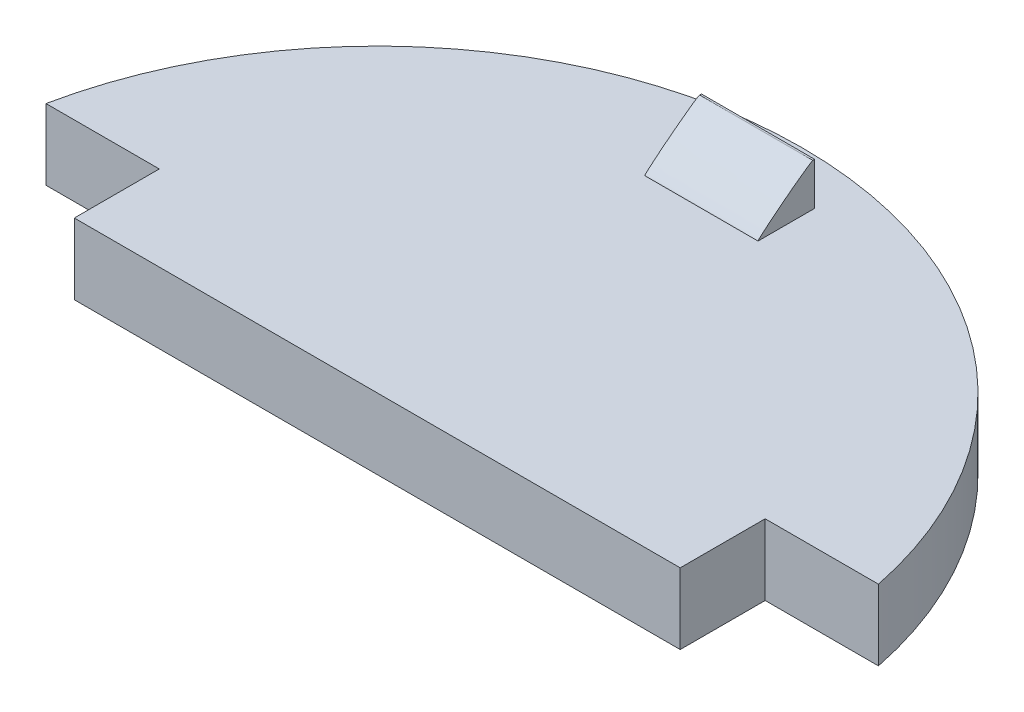
ISO-10303-21;
HEADER;
FILE_DESCRIPTION(('STEP AP214'),'2;1');
FILE_NAME('part.step','',(''),(''),'','','');
FILE_SCHEMA(('AUTOMOTIVE_DESIGN { 1 0 10303 214 1 1 1 1 }'));
ENDSEC;
DATA;
#1=APPLICATION_CONTEXT('core data for automotive mechanical design processes');
#2=APPLICATION_PROTOCOL_DEFINITION('international standard','automotive_design',2000,#1);
#3=PRODUCT_CONTEXT('',#1,'mechanical');
#4=PRODUCT('Part','Part','',(#3));
#5=PRODUCT_RELATED_PRODUCT_CATEGORY('part','',(#4));
#6=PRODUCT_DEFINITION_FORMATION('','',#4);
#7=PRODUCT_DEFINITION_CONTEXT('part definition',#1,'design');
#8=PRODUCT_DEFINITION('design','',#6,#7);
#9=PRODUCT_DEFINITION_SHAPE('','',#8);
#10=(LENGTH_UNIT() NAMED_UNIT(*) SI_UNIT(.MILLI.,.METRE.));
#11=(NAMED_UNIT(*) PLANE_ANGLE_UNIT() SI_UNIT($,.RADIAN.));
#12=(NAMED_UNIT(*) SI_UNIT($,.STERADIAN.) SOLID_ANGLE_UNIT());
#13=UNCERTAINTY_MEASURE_WITH_UNIT(LENGTH_MEASURE(1.E-05),#10,'distance_accuracy_value','');
#14=(GEOMETRIC_REPRESENTATION_CONTEXT(3) GLOBAL_UNCERTAINTY_ASSIGNED_CONTEXT((#13)) GLOBAL_UNIT_ASSIGNED_CONTEXT((#10,
#11,#12)) REPRESENTATION_CONTEXT('',''));
#15=CARTESIAN_POINT('',(0.,0.,0.));
#16=DIRECTION('',(0.,0.,1.));
#17=DIRECTION('',(1.,0.,0.));
#18=AXIS2_PLACEMENT_3D('',#15,#16,#17);
#19=CARTESIAN_POINT('',(0.,5.,0.));
#20=DIRECTION('',(0.,1.,0.));
#21=DIRECTION('',(0.,0.,1.));
#22=AXIS2_PLACEMENT_3D('',#19,#20,#21);
#23=PLANE('',#22);
#24=DIRECTION('',(-1.,0.,0.));
#25=VECTOR('',#24,1.);
#26=CARTESIAN_POINT('',(-21.3938769133982,5.,-6.));
#27=LINE('',#26,#25);
#28=CARTESIAN_POINT('',(-21.3938769133982,5.,-6.));
#29=VERTEX_POINT('',#28);
#30=CARTESIAN_POINT('',(-29.3938769133982,5.,-6.));
#31=VERTEX_POINT('',#30);
#32=EDGE_CURVE('E134',#29,#31,#27,.T.);
#33=ORIENTED_EDGE('',*,*,#32,.F.);
#34=DIRECTION('',(0.,0.,-1.));
#35=VECTOR('',#34,1.);
#36=CARTESIAN_POINT('',(-21.3938769133982,5.,0.));
#37=LINE('',#36,#35);
#38=CARTESIAN_POINT('',(-21.3938769133982,5.,0.));
#39=VERTEX_POINT('',#38);
#40=EDGE_CURVE('E126',#39,#29,#37,.T.);
#41=ORIENTED_EDGE('',*,*,#40,.F.);
#42=DIRECTION('',(1.,0.,0.));
#43=VECTOR('',#42,1.);
#44=CARTESIAN_POINT('',(-30.,5.,0.));
#45=LINE('',#44,#43);
#46=CARTESIAN_POINT('',(21.3938769133982,5.,0.));
#47=VERTEX_POINT('',#46);
#48=EDGE_CURVE('E140',#39,#47,#45,.T.);
#49=ORIENTED_EDGE('',*,*,#48,.T.);
#50=DIRECTION('',(0.,0.,1.));
#51=VECTOR('',#50,1.);
#52=CARTESIAN_POINT('',(21.3938769133982,5.,0.));
#53=LINE('',#52,#51);
#54=CARTESIAN_POINT('',(21.3938769133982,5.,-6.));
#55=VERTEX_POINT('',#54);
#56=EDGE_CURVE('E307',#55,#47,#53,.T.);
#57=ORIENTED_EDGE('',*,*,#56,.F.);
#58=DIRECTION('',(-1.,0.,0.));
#59=VECTOR('',#58,1.);
#60=CARTESIAN_POINT('',(21.3938769133982,5.,-6.));
#61=LINE('',#60,#59);
#62=CARTESIAN_POINT('',(29.3938769133982,5.,-6.));
#63=VERTEX_POINT('',#62);
#64=EDGE_CURVE('E304',#63,#55,#61,.T.);
#65=ORIENTED_EDGE('',*,*,#64,.F.);
#66=CARTESIAN_POINT('',(0.,5.,0.));
#67=DIRECTION('',(0.,1.,0.));
#68=DIRECTION('',(0.,0.,1.));
#69=AXIS2_PLACEMENT_3D('',#66,#67,#68);
#70=CIRCLE('',#69,30.);
#71=EDGE_CURVE('E149',#63,#31,#70,.T.);
#72=ORIENTED_EDGE('',*,*,#71,.T.);
#73=EDGE_LOOP('',(#33,#41,#49,#57,#65,#72));
#74=FACE_BOUND('',#73,.T.);
#75=DIRECTION('',(-1.,0.,0.));
#76=VECTOR('',#75,1.);
#77=CARTESIAN_POINT('',(-3.84159331598207,5.,-26.7316665793187));
#78=LINE('',#77,#76);
#79=CARTESIAN_POINT('',(4.15840668401793,5.,-26.7316665793187));
#80=VERTEX_POINT('',#79);
#81=CARTESIAN_POINT('',(-3.84159331598207,5.,-26.7316665793187));
#82=VERTEX_POINT('',#81);
#83=EDGE_CURVE('E183',#80,#82,#78,.T.);
#84=ORIENTED_EDGE('',*,*,#83,.F.);
#85=DIRECTION('',(0.,0.,-1.));
#86=VECTOR('',#85,1.);
#87=CARTESIAN_POINT('',(4.15840668401793,5.,-26.7316665793187));
#88=LINE('',#87,#86);
#89=CARTESIAN_POINT('',(4.15840668401793,5.,-22.7316665793187));
#90=VERTEX_POINT('',#89);
#91=EDGE_CURVE('E187',#90,#80,#88,.T.);
#92=ORIENTED_EDGE('',*,*,#91,.F.);
#93=CARTESIAN_POINT('',(-4.24159331598207,5.,-22.7316665793187));
#94=CARTESIAN_POINT('',(-1.30825998264874,5.,-22.7316665793187));
#95=CARTESIAN_POINT('',(1.6250733506846,5.,-22.7316665793187));
#96=CARTESIAN_POINT('',(4.55840668401793,5.,-22.7316665793187));
#97=(BOUNDED_CURVE() B_SPLINE_CURVE(3,(#93,#94,#95,#96),.UNSPECIFIED.,.F.,
.F.) B_SPLINE_CURVE_WITH_KNOTS((4,4),(-0.00455840668401793,0.00424159331598207),
.UNSPECIFIED.) CURVE() GEOMETRIC_REPRESENTATION_ITEM() RATIONAL_B_SPLINE_CURVE((1.,1.,1.,1.)) REPRESENTATION_ITEM(''));
#98=CARTESIAN_POINT('',(-3.84159331598207,5.,-22.7316665793187));
#99=VERTEX_POINT('',#98);
#100=EDGE_CURVE('E171',#99,#90,#97,.T.);
#101=ORIENTED_EDGE('',*,*,#100,.F.);
#102=DIRECTION('',(0.,0.,1.));
#103=VECTOR('',#102,1.);
#104=CARTESIAN_POINT('',(-3.84159331598207,5.,-26.7316665793187));
#105=LINE('',#104,#103);
#106=EDGE_CURVE('E186',#82,#99,#105,.T.);
#107=ORIENTED_EDGE('',*,*,#106,.F.);
#108=EDGE_LOOP('',(#84,#92,#101,#107));
#109=FACE_BOUND('',#108,.T.);
#110=ADVANCED_FACE('F43',(#74,#109),#23,.T.);
#111=CARTESIAN_POINT('',(0.,5.,0.));
#112=DIRECTION('',(0.,-1.,0.));
#113=DIRECTION('',(0.,0.,-1.));
#114=AXIS2_PLACEMENT_3D('',#111,#112,#113);
#115=CYLINDRICAL_SURFACE('',#114,30.);
#116=CARTESIAN_POINT('',(0.,0.,0.));
#117=DIRECTION('',(0.,1.,0.));
#118=DIRECTION('',(0.,0.,1.));
#119=AXIS2_PLACEMENT_3D('',#116,#117,#118);
#120=CIRCLE('',#119,30.);
#121=CARTESIAN_POINT('',(29.3938769133982,0.,-6.));
#122=VERTEX_POINT('',#121);
#123=CARTESIAN_POINT('',(-29.3938769133982,0.,-6.));
#124=VERTEX_POINT('',#123);
#125=EDGE_CURVE('E159',#122,#124,#120,.T.);
#126=ORIENTED_EDGE('',*,*,#125,.T.);
#127=DIRECTION('',(0.,1.,0.));
#128=VECTOR('',#127,1.);
#129=CARTESIAN_POINT('',(-29.3938769133982,-5.,-6.));
#130=LINE('',#129,#128);
#131=EDGE_CURVE('E207',#124,#31,#130,.T.);
#132=ORIENTED_EDGE('',*,*,#131,.T.);
#133=ORIENTED_EDGE('',*,*,#71,.F.);
#134=DIRECTION('',(0.,1.,0.));
#135=VECTOR('',#134,1.);
#136=CARTESIAN_POINT('',(29.3938769133982,-5.,-6.));
#137=LINE('',#136,#135);
#138=EDGE_CURVE('E178',#122,#63,#137,.T.);
#139=ORIENTED_EDGE('',*,*,#138,.F.);
#140=EDGE_LOOP('',(#126,#132,#133,#139));
#141=FACE_BOUND('',#140,.T.);
#142=ADVANCED_FACE('F278',(#141),#115,.T.);
#143=CARTESIAN_POINT('',(-30.,5.,0.));
#144=DIRECTION('',(0.,0.,-1.));
#145=DIRECTION('',(-1.,0.,0.));
#146=AXIS2_PLACEMENT_3D('',#143,#144,#145);
#147=PLANE('',#146);
#148=ORIENTED_EDGE('',*,*,#48,.F.);
#149=DIRECTION('',(0.,1.,0.));
#150=VECTOR('',#149,1.);
#151=CARTESIAN_POINT('',(-21.3938769133982,-5.,0.));
#152=LINE('',#151,#150);
#153=CARTESIAN_POINT('',(-21.3938769133982,0.,0.));
#154=VERTEX_POINT('',#153);
#155=EDGE_CURVE('E123',#154,#39,#152,.T.);
#156=ORIENTED_EDGE('',*,*,#155,.F.);
#157=DIRECTION('',(1.,0.,0.));
#158=VECTOR('',#157,1.);
#159=CARTESIAN_POINT('',(-30.,0.,0.));
#160=LINE('',#159,#158);
#161=CARTESIAN_POINT('',(21.3938769133982,0.,0.));
#162=VERTEX_POINT('',#161);
#163=EDGE_CURVE('E155',#154,#162,#160,.T.);
#164=ORIENTED_EDGE('',*,*,#163,.T.);
#165=DIRECTION('',(0.,1.,0.));
#166=VECTOR('',#165,1.);
#167=CARTESIAN_POINT('',(21.3938769133982,-5.,0.));
#168=LINE('',#167,#166);
#169=EDGE_CURVE('E143',#162,#47,#168,.T.);
#170=ORIENTED_EDGE('',*,*,#169,.T.);
#171=EDGE_LOOP('',(#148,#156,#164,#170));
#172=FACE_BOUND('',#171,.T.);
#173=ADVANCED_FACE('F146',(#172),#147,.F.);
#174=CARTESIAN_POINT('',(0.,0.,0.));
#175=DIRECTION('',(0.,1.,0.));
#176=DIRECTION('',(0.,0.,1.));
#177=AXIS2_PLACEMENT_3D('',#174,#175,#176);
#178=PLANE('',#177);
#179=DIRECTION('',(0.,0.,-1.));
#180=VECTOR('',#179,1.);
#181=CARTESIAN_POINT('',(-21.3938769133982,0.,0.));
#182=LINE('',#181,#180);
#183=CARTESIAN_POINT('',(-21.3938769133982,0.,-6.));
#184=VERTEX_POINT('',#183);
#185=EDGE_CURVE('E56',#154,#184,#182,.T.);
#186=ORIENTED_EDGE('',*,*,#185,.T.);
#187=DIRECTION('',(-1.,0.,0.));
#188=VECTOR('',#187,1.);
#189=CARTESIAN_POINT('',(0.,0.,-6.));
#190=LINE('',#189,#188);
#191=EDGE_CURVE('E12',#184,#124,#190,.T.);
#192=ORIENTED_EDGE('',*,*,#191,.T.);
#193=ORIENTED_EDGE('',*,*,#125,.F.);
#194=DIRECTION('',(-1.,0.,0.));
#195=VECTOR('',#194,1.);
#196=CARTESIAN_POINT('',(0.,0.,-6.));
#197=LINE('',#196,#195);
#198=CARTESIAN_POINT('',(21.3938769133982,0.,-6.));
#199=VERTEX_POINT('',#198);
#200=EDGE_CURVE('E267',#122,#199,#197,.T.);
#201=ORIENTED_EDGE('',*,*,#200,.T.);
#202=DIRECTION('',(0.,0.,1.));
#203=VECTOR('',#202,1.);
#204=CARTESIAN_POINT('',(21.3938769133982,0.,0.));
#205=LINE('',#204,#203);
#206=EDGE_CURVE('E317',#199,#162,#205,.T.);
#207=ORIENTED_EDGE('',*,*,#206,.T.);
#208=ORIENTED_EDGE('',*,*,#163,.F.);
#209=EDGE_LOOP('',(#186,#192,#193,#201,#207,#208));
#210=FACE_BOUND('',#209,.T.);
#211=ADVANCED_FACE('F281',(#210),#178,.F.);
#212=CARTESIAN_POINT('',(4.15840668401793,8.,-26.7316665793187));
#213=DIRECTION('',(-1.,0.,0.));
#214=DIRECTION('',(0.,0.,1.));
#215=AXIS2_PLACEMENT_3D('',#212,#213,#214);
#216=PLANE('',#215);
#217=DIRECTION('',(0.,0.,-1.));
#218=VECTOR('',#217,1.);
#219=CARTESIAN_POINT('',(4.15840668401793,8.,-26.7316665793187));
#220=LINE('',#219,#218);
#221=CARTESIAN_POINT('',(4.15840668401793,8.,-26.6046499255261));
#222=VERTEX_POINT('',#221);
#223=CARTESIAN_POINT('',(4.15840668401793,8.,-26.7316665793187));
#224=VERTEX_POINT('',#223);
#225=EDGE_CURVE('E166',#222,#224,#220,.T.);
#226=ORIENTED_EDGE('',*,*,#225,.F.);
#227=CARTESIAN_POINT('',(4.15840668401793,5.,-22.7316665793187));
#228=CARTESIAN_POINT('',(4.15840668401793,8.,-23.5062632485602));
#229=CARTESIAN_POINT('',(4.15840668401793,8.,-26.6046499255261));
#230=(BOUNDED_CURVE() B_SPLINE_CURVE(2,(#227,#228,#229),.UNSPECIFIED.,.F.,
.F.) B_SPLINE_CURVE_WITH_KNOTS((3,3),(0.,1.),
.UNSPECIFIED.) CURVE() GEOMETRIC_REPRESENTATION_ITEM() RATIONAL_B_SPLINE_CURVE((1.,
0.0574959574576069,1.)) REPRESENTATION_ITEM(''));
#231=EDGE_CURVE('E154',#222,#90,#230,.F.);
#232=ORIENTED_EDGE('',*,*,#231,.T.);
#233=ORIENTED_EDGE('',*,*,#91,.T.);
#234=DIRECTION('',(0.,-1.,0.));
#235=VECTOR('',#234,1.);
#236=CARTESIAN_POINT('',(4.15840668401793,8.,-26.7316665793187));
#237=LINE('',#236,#235);
#238=EDGE_CURVE('E163',#224,#80,#237,.T.);
#239=ORIENTED_EDGE('',*,*,#238,.F.);
#240=EDGE_LOOP('',(#226,#232,#233,#239));
#241=FACE_BOUND('',#240,.T.);
#242=ADVANCED_FACE('F202',(#241),#216,.F.);
#243=CARTESIAN_POINT('',(-3.84159331598207,8.,-26.7316665793187));
#244=DIRECTION('',(0.,0.,1.));
#245=DIRECTION('',(1.,0.,0.));
#246=AXIS2_PLACEMENT_3D('',#243,#244,#245);
#247=PLANE('',#246);
#248=ORIENTED_EDGE('',*,*,#83,.T.);
#249=DIRECTION('',(0.,-1.,0.));
#250=VECTOR('',#249,1.);
#251=CARTESIAN_POINT('',(-3.84159331598207,8.,-26.7316665793187));
#252=LINE('',#251,#250);
#253=CARTESIAN_POINT('',(-3.84159331598207,8.,-26.7316665793187));
#254=VERTEX_POINT('',#253);
#255=EDGE_CURVE('E188',#254,#82,#252,.T.);
#256=ORIENTED_EDGE('',*,*,#255,.F.);
#257=DIRECTION('',(-1.,0.,0.));
#258=VECTOR('',#257,1.);
#259=CARTESIAN_POINT('',(-3.84159331598207,8.,-26.7316665793187));
#260=LINE('',#259,#258);
#261=EDGE_CURVE('E170',#224,#254,#260,.T.);
#262=ORIENTED_EDGE('',*,*,#261,.F.);
#263=ORIENTED_EDGE('',*,*,#238,.T.);
#264=EDGE_LOOP('',(#248,#256,#262,#263));
#265=FACE_BOUND('',#264,.T.);
#266=ADVANCED_FACE('F196',(#265),#247,.F.);
#267=CARTESIAN_POINT('',(-3.84159331598207,8.,-26.7316665793187));
#268=DIRECTION('',(1.,0.,0.));
#269=DIRECTION('',(0.,0.,-1.));
#270=AXIS2_PLACEMENT_3D('',#267,#268,#269);
#271=PLANE('',#270);
#272=ORIENTED_EDGE('',*,*,#106,.T.);
#273=CARTESIAN_POINT('',(-3.84159331598207,8.,-26.6046499255261));
#274=CARTESIAN_POINT('',(-3.84159331598207,8.,-23.5062632485602));
#275=CARTESIAN_POINT('',(-3.84159331598207,5.,-22.7316665793187));
#276=(BOUNDED_CURVE() B_SPLINE_CURVE(2,(#273,#274,#275),.UNSPECIFIED.,.F.,
.F.) B_SPLINE_CURVE_WITH_KNOTS((3,3),(0.,1.),
.UNSPECIFIED.) CURVE() GEOMETRIC_REPRESENTATION_ITEM() RATIONAL_B_SPLINE_CURVE((1.,
0.0574959574576069,1.)) REPRESENTATION_ITEM(''));
#277=CARTESIAN_POINT('',(-3.84159331598207,8.,-26.6046499255261));
#278=VERTEX_POINT('',#277);
#279=EDGE_CURVE('E245',#99,#278,#276,.F.);
#280=ORIENTED_EDGE('',*,*,#279,.T.);
#281=DIRECTION('',(0.,0.,1.));
#282=VECTOR('',#281,1.);
#283=CARTESIAN_POINT('',(-3.84159331598207,8.,-26.7316665793187));
#284=LINE('',#283,#282);
#285=EDGE_CURVE('E172',#254,#278,#284,.T.);
#286=ORIENTED_EDGE('',*,*,#285,.F.);
#287=ORIENTED_EDGE('',*,*,#255,.T.);
#288=EDGE_LOOP('',(#272,#280,#286,#287));
#289=FACE_BOUND('',#288,.T.);
#290=ADVANCED_FACE('F325',(#289),#271,.F.);
#291=CARTESIAN_POINT('',(0.,8.,0.));
#292=DIRECTION('',(0.,1.,0.));
#293=DIRECTION('',(0.,0.,1.));
#294=AXIS2_PLACEMENT_3D('',#291,#292,#293);
#295=PLANE('',#294);
#296=ORIENTED_EDGE('',*,*,#285,.T.);
#297=CARTESIAN_POINT('',(4.55840668401793,8.,-26.6046499255261));
#298=CARTESIAN_POINT('',(1.6250733506846,8.,-26.6046499255261));
#299=CARTESIAN_POINT('',(-1.30825998264874,8.,-26.6046499255261));
#300=CARTESIAN_POINT('',(-4.24159331598207,8.,-26.6046499255261));
#301=(BOUNDED_CURVE() B_SPLINE_CURVE(3,(#297,#298,#299,#300),.UNSPECIFIED.,.F.,
.F.) B_SPLINE_CURVE_WITH_KNOTS((4,4),(-0.00455840668401793,0.00424159331598207),
.UNSPECIFIED.) CURVE() GEOMETRIC_REPRESENTATION_ITEM() RATIONAL_B_SPLINE_CURVE((1.,1.,1.,1.)) REPRESENTATION_ITEM(''));
#302=EDGE_CURVE('E148',#278,#222,#301,.F.);
#303=ORIENTED_EDGE('',*,*,#302,.T.);
#304=ORIENTED_EDGE('',*,*,#225,.T.);
#305=ORIENTED_EDGE('',*,*,#261,.T.);
#306=EDGE_LOOP('',(#296,#303,#304,#305));
#307=FACE_BOUND('',#306,.T.);
#308=ADVANCED_FACE('F328',(#307),#295,.T.);
#309=CARTESIAN_POINT('',(4.55840668401793,5.,-22.7316665793187));
#310=CARTESIAN_POINT('',(1.6250733506846,5.,-22.7316665793187));
#311=CARTESIAN_POINT('',(-1.30825998264874,5.,-22.7316665793187));
#312=CARTESIAN_POINT('',(-4.24159331598207,5.,-22.7316665793187));
#313=CARTESIAN_POINT('',(4.55840668401793,8.,-23.5062632485602));
#314=CARTESIAN_POINT('',(1.6250733506846,8.,-23.5062632485602));
#315=CARTESIAN_POINT('',(-1.30825998264874,8.,-23.5062632485602));
#316=CARTESIAN_POINT('',(-4.24159331598207,8.,-23.5062632485602));
#317=CARTESIAN_POINT('',(4.55840668401793,8.,-26.6046499255261));
#318=CARTESIAN_POINT('',(1.6250733506846,8.,-26.6046499255261));
#319=CARTESIAN_POINT('',(-1.30825998264874,8.,-26.6046499255261));
#320=CARTESIAN_POINT('',(-4.24159331598207,8.,-26.6046499255261));
#321=(BOUNDED_SURFACE() B_SPLINE_SURFACE(2,3,((#309,#310,#311,#312),(#313,#314,#315,#316),(#317,
#318,#319,#320)),.UNSPECIFIED.,.F.,.F.,.F.) B_SPLINE_SURFACE_WITH_KNOTS((3,3),(4,4),(0.,1.),
(-0.00455840668401793,0.00424159331598207),
.UNSPECIFIED.) GEOMETRIC_REPRESENTATION_ITEM() RATIONAL_B_SPLINE_SURFACE(((1.,1.,1.,1.),
(0.0574959574576069,0.0574959574576069,0.0574959574576069,0.0574959574576069),(1.,1.,1.,1.))) REPRESENTATION_ITEM('') SURFACE());
#322=ORIENTED_EDGE('',*,*,#279,.F.);
#323=ORIENTED_EDGE('',*,*,#100,.T.);
#324=ORIENTED_EDGE('',*,*,#231,.F.);
#325=ORIENTED_EDGE('',*,*,#302,.F.);
#326=EDGE_LOOP('',(#322,#323,#324,#325));
#327=FACE_BOUND('',#326,.T.);
#328=ADVANCED_FACE('F46',(#327),#321,.T.);
#329=CARTESIAN_POINT('',(21.3938769133982,-5.,0.));
#330=DIRECTION('',(-1.,0.,0.));
#331=DIRECTION('',(0.,0.,1.));
#332=AXIS2_PLACEMENT_3D('',#329,#330,#331);
#333=PLANE('',#332);
#334=DIRECTION('',(0.,1.,0.));
#335=VECTOR('',#334,1.);
#336=CARTESIAN_POINT('',(21.3938769133982,-5.,-6.));
#337=LINE('',#336,#335);
#338=EDGE_CURVE('E71',#199,#55,#337,.T.);
#339=ORIENTED_EDGE('',*,*,#338,.T.);
#340=ORIENTED_EDGE('',*,*,#56,.T.);
#341=ORIENTED_EDGE('',*,*,#169,.F.);
#342=ORIENTED_EDGE('',*,*,#206,.F.);
#343=EDGE_LOOP('',(#339,#340,#341,#342));
#344=FACE_BOUND('',#343,.T.);
#345=ADVANCED_FACE('F316',(#344),#333,.F.);
#346=CARTESIAN_POINT('',(21.3938769133982,-5.,-6.));
#347=DIRECTION('',(0.,0.,-1.));
#348=DIRECTION('',(-1.,0.,0.));
#349=AXIS2_PLACEMENT_3D('',#346,#347,#348);
#350=PLANE('',#349);
#351=ORIENTED_EDGE('',*,*,#138,.T.);
#352=ORIENTED_EDGE('',*,*,#64,.T.);
#353=ORIENTED_EDGE('',*,*,#338,.F.);
#354=ORIENTED_EDGE('',*,*,#200,.F.);
#355=EDGE_LOOP('',(#351,#352,#353,#354));
#356=FACE_BOUND('',#355,.T.);
#357=ADVANCED_FACE('F315',(#356),#350,.F.);
#358=CARTESIAN_POINT('',(-21.3938769133982,-5.,-6.));
#359=DIRECTION('',(0.,0.,-1.));
#360=DIRECTION('',(-1.,0.,0.));
#361=AXIS2_PLACEMENT_3D('',#358,#359,#360);
#362=PLANE('',#361);
#363=DIRECTION('',(0.,1.,0.));
#364=VECTOR('',#363,1.);
#365=CARTESIAN_POINT('',(-21.3938769133982,-5.,-6.));
#366=LINE('',#365,#364);
#367=EDGE_CURVE('E63',#184,#29,#366,.T.);
#368=ORIENTED_EDGE('',*,*,#367,.T.);
#369=ORIENTED_EDGE('',*,*,#32,.T.);
#370=ORIENTED_EDGE('',*,*,#131,.F.);
#371=ORIENTED_EDGE('',*,*,#191,.F.);
#372=EDGE_LOOP('',(#368,#369,#370,#371));
#373=FACE_BOUND('',#372,.T.);
#374=ADVANCED_FACE('F297',(#373),#362,.F.);
#375=CARTESIAN_POINT('',(-21.3938769133982,-5.,0.));
#376=DIRECTION('',(1.,0.,0.));
#377=DIRECTION('',(0.,0.,-1.));
#378=AXIS2_PLACEMENT_3D('',#375,#376,#377);
#379=PLANE('',#378);
#380=ORIENTED_EDGE('',*,*,#155,.T.);
#381=ORIENTED_EDGE('',*,*,#40,.T.);
#382=ORIENTED_EDGE('',*,*,#367,.F.);
#383=ORIENTED_EDGE('',*,*,#185,.F.);
#384=EDGE_LOOP('',(#380,#381,#382,#383));
#385=FACE_BOUND('',#384,.T.);
#386=ADVANCED_FACE('F125',(#385),#379,.F.);
#387=CLOSED_SHELL('',(#110,#142,#173,#211,#242,#266,#290,#308,#328,#345,#357,#374,#386));
#388=MANIFOLD_SOLID_BREP('B2',#387);
#389=ADVANCED_BREP_SHAPE_REPRESENTATION('',(#18,#388),#14);
#390=SHAPE_DEFINITION_REPRESENTATION(#9,#389);
ENDSEC;
END-ISO-10303-21;
